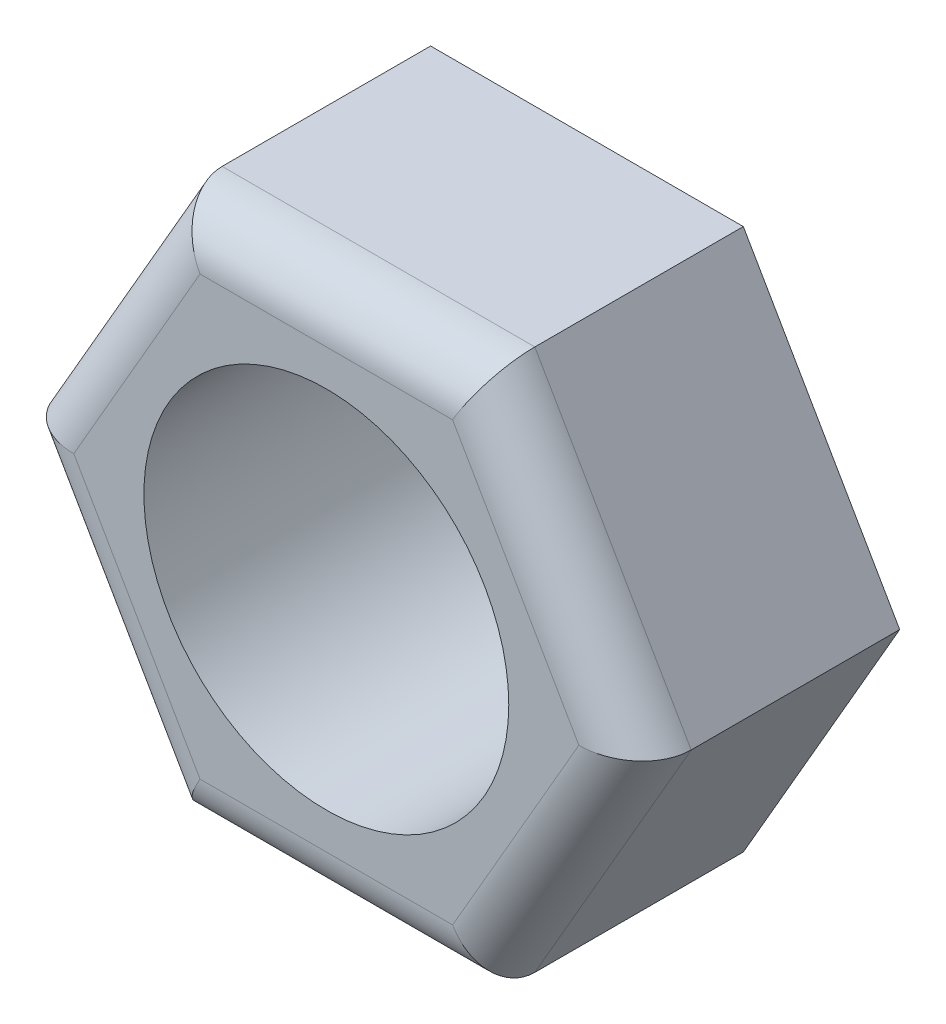
ISO-10303-21;
HEADER;
FILE_DESCRIPTION(('STEP AP214'),'2;1');
FILE_NAME('part.step','',(''),(''),'','','');
FILE_SCHEMA(('AUTOMOTIVE_DESIGN { 1 0 10303 214 1 1 1 1 }'));
ENDSEC;
DATA;
#1=APPLICATION_CONTEXT('core data for automotive mechanical design processes');
#2=APPLICATION_PROTOCOL_DEFINITION('international standard','automotive_design',2000,#1);
#3=PRODUCT_CONTEXT('',#1,'mechanical');
#4=PRODUCT('Part','Part','',(#3));
#5=PRODUCT_RELATED_PRODUCT_CATEGORY('part','',(#4));
#6=PRODUCT_DEFINITION_FORMATION('','',#4);
#7=PRODUCT_DEFINITION_CONTEXT('part definition',#1,'design');
#8=PRODUCT_DEFINITION('design','',#6,#7);
#9=PRODUCT_DEFINITION_SHAPE('','',#8);
#10=(LENGTH_UNIT() NAMED_UNIT(*) SI_UNIT(.MILLI.,.METRE.));
#11=(NAMED_UNIT(*) PLANE_ANGLE_UNIT() SI_UNIT($,.RADIAN.));
#12=(NAMED_UNIT(*) SI_UNIT($,.STERADIAN.) SOLID_ANGLE_UNIT());
#13=UNCERTAINTY_MEASURE_WITH_UNIT(LENGTH_MEASURE(1.E-05),#10,'distance_accuracy_value','');
#14=(GEOMETRIC_REPRESENTATION_CONTEXT(3) GLOBAL_UNCERTAINTY_ASSIGNED_CONTEXT((#13)) GLOBAL_UNIT_ASSIGNED_CONTEXT((#10,
#11,#12)) REPRESENTATION_CONTEXT('',''));
#15=CARTESIAN_POINT('',(0.,0.,0.));
#16=DIRECTION('',(0.,0.,1.));
#17=DIRECTION('',(1.,0.,0.));
#18=AXIS2_PLACEMENT_3D('',#15,#16,#17);
#19=CARTESIAN_POINT('',(0.,0.,2.5));
#20=DIRECTION('',(0.,0.,1.));
#21=DIRECTION('',(1.,0.,0.));
#22=AXIS2_PLACEMENT_3D('',#19,#20,#21);
#23=PLANE('',#22);
#24=DIRECTION('',(-1.,0.,0.));
#25=VECTOR('',#24,1.);
#26=CARTESIAN_POINT('',(-1.5,2.09807621135332,2.5));
#27=LINE('',#26,#25);
#28=CARTESIAN_POINT('',(1.21132486540518,2.09807621135332,2.5));
#29=VERTEX_POINT('',#28);
#30=CARTESIAN_POINT('',(-1.21132486540519,2.09807621135332,2.5));
#31=VERTEX_POINT('',#30);
#32=EDGE_CURVE('E110',#29,#31,#27,.T.);
#33=ORIENTED_EDGE('',*,*,#32,.T.);
#34=DIRECTION('',(-0.5,-0.866025403784439,0.));
#35=VECTOR('',#34,1.);
#36=CARTESIAN_POINT('',(-2.56698729810778,-0.250000000000002,2.5));
#37=LINE('',#36,#35);
#38=CARTESIAN_POINT('',(-2.42264973081038,0.,2.5));
#39=VERTEX_POINT('',#38);
#40=EDGE_CURVE('E160',#31,#39,#37,.T.);
#41=ORIENTED_EDGE('',*,*,#40,.T.);
#42=DIRECTION('',(0.5,-0.866025403784439,0.));
#43=VECTOR('',#42,1.);
#44=CARTESIAN_POINT('',(-1.06698729810778,-2.34807621135332,2.5));
#45=LINE('',#44,#43);
#46=CARTESIAN_POINT('',(-1.21132486540519,-2.09807621135332,2.5));
#47=VERTEX_POINT('',#46);
#48=EDGE_CURVE('E158',#39,#47,#45,.T.);
#49=ORIENTED_EDGE('',*,*,#48,.T.);
#50=DIRECTION('',(1.,0.,0.));
#51=VECTOR('',#50,1.);
#52=CARTESIAN_POINT('',(1.5,-2.09807621135332,2.5));
#53=LINE('',#52,#51);
#54=CARTESIAN_POINT('',(1.21132486540518,-2.09807621135332,2.5));
#55=VERTEX_POINT('',#54);
#56=EDGE_CURVE('E156',#47,#55,#53,.T.);
#57=ORIENTED_EDGE('',*,*,#56,.T.);
#58=DIRECTION('',(0.500000000000001,0.866025403784438,0.));
#59=VECTOR('',#58,1.);
#60=CARTESIAN_POINT('',(2.56698729810778,0.250000000000001,2.5));
#61=LINE('',#60,#59);
#62=CARTESIAN_POINT('',(2.42264973081037,0.,2.5));
#63=VERTEX_POINT('',#62);
#64=EDGE_CURVE('E154',#55,#63,#61,.T.);
#65=ORIENTED_EDGE('',*,*,#64,.T.);
#66=DIRECTION('',(-0.5,0.866025403784438,0.));
#67=VECTOR('',#66,1.);
#68=CARTESIAN_POINT('',(1.06698729810778,2.34807621135332,2.5));
#69=LINE('',#68,#67);
#70=EDGE_CURVE('E152',#63,#29,#69,.T.);
#71=ORIENTED_EDGE('',*,*,#70,.T.);
#72=EDGE_LOOP('',(#33,#41,#49,#57,#65,#71));
#73=FACE_BOUND('',#72,.T.);
#74=CARTESIAN_POINT('',(0.,0.,2.5));
#75=DIRECTION('',(0.,0.,1.));
#76=DIRECTION('',(1.,0.,0.));
#77=AXIS2_PLACEMENT_3D('',#74,#75,#76);
#78=CIRCLE('',#77,1.75);
#79=CARTESIAN_POINT('',(1.75,0.,2.5));
#80=VERTEX_POINT('',#79);
#81=EDGE_CURVE('E127',#80,#80,#78,.T.);
#82=ORIENTED_EDGE('',*,*,#81,.F.);
#83=EDGE_LOOP('',(#82));
#84=FACE_BOUND('',#83,.T.);
#85=ADVANCED_FACE('F33',(#73,#84),#23,.T.);
#86=CARTESIAN_POINT('',(0.,0.,0.));
#87=DIRECTION('',(0.,0.,1.));
#88=DIRECTION('',(1.,0.,0.));
#89=AXIS2_PLACEMENT_3D('',#86,#87,#88);
#90=PLANE('',#89);
#91=DIRECTION('',(0.5,0.866025403784438,0.));
#92=VECTOR('',#91,1.);
#93=CARTESIAN_POINT('',(1.5,-2.59807621135332,0.));
#94=LINE('',#93,#92);
#95=CARTESIAN_POINT('',(1.5,-2.59807621135332,0.));
#96=VERTEX_POINT('',#95);
#97=CARTESIAN_POINT('',(3.,0.,0.));
#98=VERTEX_POINT('',#97);
#99=EDGE_CURVE('E118',#96,#98,#94,.T.);
#100=ORIENTED_EDGE('',*,*,#99,.F.);
#101=DIRECTION('',(1.,0.,0.));
#102=VECTOR('',#101,1.);
#103=CARTESIAN_POINT('',(-1.5,-2.59807621135332,0.));
#104=LINE('',#103,#102);
#105=CARTESIAN_POINT('',(-1.5,-2.59807621135332,0.));
#106=VERTEX_POINT('',#105);
#107=EDGE_CURVE('E141',#106,#96,#104,.T.);
#108=ORIENTED_EDGE('',*,*,#107,.F.);
#109=DIRECTION('',(0.5,-0.866025403784439,0.));
#110=VECTOR('',#109,1.);
#111=CARTESIAN_POINT('',(-3.,0.,0.));
#112=LINE('',#111,#110);
#113=CARTESIAN_POINT('',(-3.,0.,0.));
#114=VERTEX_POINT('',#113);
#115=EDGE_CURVE('E138',#114,#106,#112,.T.);
#116=ORIENTED_EDGE('',*,*,#115,.F.);
#117=DIRECTION('',(-0.5,-0.866025403784438,0.));
#118=VECTOR('',#117,1.);
#119=CARTESIAN_POINT('',(-1.5,2.59807621135332,0.));
#120=LINE('',#119,#118);
#121=CARTESIAN_POINT('',(-1.5,2.59807621135332,0.));
#122=VERTEX_POINT('',#121);
#123=EDGE_CURVE('E135',#122,#114,#120,.T.);
#124=ORIENTED_EDGE('',*,*,#123,.F.);
#125=DIRECTION('',(-1.,0.,0.));
#126=VECTOR('',#125,1.);
#127=CARTESIAN_POINT('',(1.49999999999999,2.59807621135332,0.));
#128=LINE('',#127,#126);
#129=CARTESIAN_POINT('',(1.49999999999999,2.59807621135332,0.));
#130=VERTEX_POINT('',#129);
#131=EDGE_CURVE('E121',#130,#122,#128,.T.);
#132=ORIENTED_EDGE('',*,*,#131,.F.);
#133=DIRECTION('',(-0.5,0.866025403784438,0.));
#134=VECTOR('',#133,1.);
#135=CARTESIAN_POINT('',(3.,0.,0.));
#136=LINE('',#135,#134);
#137=EDGE_CURVE('E105',#98,#130,#136,.T.);
#138=ORIENTED_EDGE('',*,*,#137,.F.);
#139=EDGE_LOOP('',(#100,#108,#116,#124,#132,#138));
#140=FACE_BOUND('',#139,.T.);
#141=CARTESIAN_POINT('',(0.,0.,0.));
#142=DIRECTION('',(0.,0.,1.));
#143=DIRECTION('',(1.,0.,0.));
#144=AXIS2_PLACEMENT_3D('',#141,#142,#143);
#145=CIRCLE('',#144,1.75);
#146=CARTESIAN_POINT('',(1.75,0.,0.));
#147=VERTEX_POINT('',#146);
#148=EDGE_CURVE('E130',#147,#147,#145,.T.);
#149=ORIENTED_EDGE('',*,*,#148,.T.);
#150=EDGE_LOOP('',(#149));
#151=FACE_BOUND('',#150,.T.);
#152=ADVANCED_FACE('F115',(#140,#151),#90,.F.);
#153=CARTESIAN_POINT('',(1.5,-2.59807621135332,2.5));
#154=DIRECTION('',(-0.866025403784438,0.5,0.));
#155=DIRECTION('',(-0.500000000000001,-0.866025403784438,0.));
#156=AXIS2_PLACEMENT_3D('',#153,#154,#155);
#157=PLANE('',#156);
#158=DIRECTION('',(0.,0.,-1.));
#159=VECTOR('',#158,1.);
#160=CARTESIAN_POINT('',(3.,0.,2.5));
#161=LINE('',#160,#159);
#162=CARTESIAN_POINT('',(3.,0.,2.));
#163=VERTEX_POINT('',#162);
#164=EDGE_CURVE('E102',#163,#98,#161,.T.);
#165=ORIENTED_EDGE('',*,*,#164,.F.);
#166=DIRECTION('',(0.500000000000001,0.866025403784438,0.));
#167=VECTOR('',#166,1.);
#168=CARTESIAN_POINT('',(1.5,-2.59807621135332,2.));
#169=LINE('',#168,#167);
#170=CARTESIAN_POINT('',(1.5,-2.59807621135332,2.));
#171=VERTEX_POINT('',#170);
#172=EDGE_CURVE('E170',#163,#171,#169,.F.);
#173=ORIENTED_EDGE('',*,*,#172,.T.);
#174=DIRECTION('',(0.,0.,-1.));
#175=VECTOR('',#174,1.);
#176=CARTESIAN_POINT('',(1.5,-2.59807621135332,2.5));
#177=LINE('',#176,#175);
#178=EDGE_CURVE('E125',#171,#96,#177,.T.);
#179=ORIENTED_EDGE('',*,*,#178,.T.);
#180=ORIENTED_EDGE('',*,*,#99,.T.);
#181=EDGE_LOOP('',(#165,#173,#179,#180));
#182=FACE_BOUND('',#181,.T.);
#183=ADVANCED_FACE('F123',(#182),#157,.F.);
#184=CARTESIAN_POINT('',(3.,0.,2.5));
#185=DIRECTION('',(-0.866025403784438,-0.5,0.));
#186=DIRECTION('',(0.5,-0.866025403784438,0.));
#187=AXIS2_PLACEMENT_3D('',#184,#185,#186);
#188=PLANE('',#187);
#189=DIRECTION('',(0.,0.,-1.));
#190=VECTOR('',#189,1.);
#191=CARTESIAN_POINT('',(1.49999999999999,2.59807621135332,2.5));
#192=LINE('',#191,#190);
#193=CARTESIAN_POINT('',(1.49999999999999,2.59807621135332,2.));
#194=VERTEX_POINT('',#193);
#195=EDGE_CURVE('E111',#194,#130,#192,.T.);
#196=ORIENTED_EDGE('',*,*,#195,.F.);
#197=DIRECTION('',(-0.5,0.866025403784438,0.));
#198=VECTOR('',#197,1.);
#199=CARTESIAN_POINT('',(3.,0.,2.));
#200=LINE('',#199,#198);
#201=EDGE_CURVE('E42',#194,#163,#200,.F.);
#202=ORIENTED_EDGE('',*,*,#201,.T.);
#203=ORIENTED_EDGE('',*,*,#164,.T.);
#204=ORIENTED_EDGE('',*,*,#137,.T.);
#205=EDGE_LOOP('',(#196,#202,#203,#204));
#206=FACE_BOUND('',#205,.T.);
#207=ADVANCED_FACE('F104',(#206),#188,.F.);
#208=CARTESIAN_POINT('',(1.49999999999999,2.59807621135332,2.5));
#209=DIRECTION('',(0.,-1.,0.));
#210=DIRECTION('',(0.,0.,-1.));
#211=AXIS2_PLACEMENT_3D('',#208,#209,#210);
#212=PLANE('',#211);
#213=DIRECTION('',(0.,0.,-1.));
#214=VECTOR('',#213,1.);
#215=CARTESIAN_POINT('',(-1.5,2.59807621135332,2.5));
#216=LINE('',#215,#214);
#217=CARTESIAN_POINT('',(-1.5,2.59807621135332,2.));
#218=VERTEX_POINT('',#217);
#219=EDGE_CURVE('E148',#218,#122,#216,.T.);
#220=ORIENTED_EDGE('',*,*,#219,.F.);
#221=DIRECTION('',(-1.,0.,0.));
#222=VECTOR('',#221,1.);
#223=CARTESIAN_POINT('',(1.49999999999999,2.59807621135332,2.));
#224=LINE('',#223,#222);
#225=EDGE_CURVE('E11',#218,#194,#224,.F.);
#226=ORIENTED_EDGE('',*,*,#225,.T.);
#227=ORIENTED_EDGE('',*,*,#195,.T.);
#228=ORIENTED_EDGE('',*,*,#131,.T.);
#229=EDGE_LOOP('',(#220,#226,#227,#228));
#230=FACE_BOUND('',#229,.T.);
#231=ADVANCED_FACE('F224',(#230),#212,.F.);
#232=CARTESIAN_POINT('',(-1.5,2.59807621135332,2.5));
#233=DIRECTION('',(0.866025403784439,-0.5,0.));
#234=DIRECTION('',(0.5,0.866025403784439,0.));
#235=AXIS2_PLACEMENT_3D('',#232,#233,#234);
#236=PLANE('',#235);
#237=DIRECTION('',(0.,0.,-1.));
#238=VECTOR('',#237,1.);
#239=CARTESIAN_POINT('',(-3.,0.,2.5));
#240=LINE('',#239,#238);
#241=CARTESIAN_POINT('',(-3.,0.,2.));
#242=VERTEX_POINT('',#241);
#243=EDGE_CURVE('E146',#242,#114,#240,.T.);
#244=ORIENTED_EDGE('',*,*,#243,.F.);
#245=DIRECTION('',(-0.5,-0.866025403784439,0.));
#246=VECTOR('',#245,1.);
#247=CARTESIAN_POINT('',(-1.5,2.59807621135332,2.));
#248=LINE('',#247,#246);
#249=EDGE_CURVE('E163',#242,#218,#248,.F.);
#250=ORIENTED_EDGE('',*,*,#249,.T.);
#251=ORIENTED_EDGE('',*,*,#219,.T.);
#252=ORIENTED_EDGE('',*,*,#123,.T.);
#253=EDGE_LOOP('',(#244,#250,#251,#252));
#254=FACE_BOUND('',#253,.T.);
#255=ADVANCED_FACE('F220',(#254),#236,.F.);
#256=CARTESIAN_POINT('',(-3.,0.,2.5));
#257=DIRECTION('',(0.866025403784439,0.5,0.));
#258=DIRECTION('',(-0.5,0.866025403784439,0.));
#259=AXIS2_PLACEMENT_3D('',#256,#257,#258);
#260=PLANE('',#259);
#261=DIRECTION('',(0.,0.,-1.));
#262=VECTOR('',#261,1.);
#263=CARTESIAN_POINT('',(-1.5,-2.59807621135332,2.5));
#264=LINE('',#263,#262);
#265=CARTESIAN_POINT('',(-1.5,-2.59807621135332,2.));
#266=VERTEX_POINT('',#265);
#267=EDGE_CURVE('E144',#266,#106,#264,.T.);
#268=ORIENTED_EDGE('',*,*,#267,.F.);
#269=DIRECTION('',(0.5,-0.866025403784439,0.));
#270=VECTOR('',#269,1.);
#271=CARTESIAN_POINT('',(-3.,0.,2.));
#272=LINE('',#271,#270);
#273=EDGE_CURVE('E166',#266,#242,#272,.F.);
#274=ORIENTED_EDGE('',*,*,#273,.T.);
#275=ORIENTED_EDGE('',*,*,#243,.T.);
#276=ORIENTED_EDGE('',*,*,#115,.T.);
#277=EDGE_LOOP('',(#268,#274,#275,#276));
#278=FACE_BOUND('',#277,.T.);
#279=ADVANCED_FACE('F206',(#278),#260,.F.);
#280=CARTESIAN_POINT('',(-1.5,-2.59807621135332,2.5));
#281=DIRECTION('',(0.,1.,0.));
#282=DIRECTION('',(0.,0.,1.));
#283=AXIS2_PLACEMENT_3D('',#280,#281,#282);
#284=PLANE('',#283);
#285=ORIENTED_EDGE('',*,*,#178,.F.);
#286=DIRECTION('',(1.,0.,0.));
#287=VECTOR('',#286,1.);
#288=CARTESIAN_POINT('',(-1.5,-2.59807621135332,2.));
#289=LINE('',#288,#287);
#290=EDGE_CURVE('E168',#171,#266,#289,.F.);
#291=ORIENTED_EDGE('',*,*,#290,.T.);
#292=ORIENTED_EDGE('',*,*,#267,.T.);
#293=ORIENTED_EDGE('',*,*,#107,.T.);
#294=EDGE_LOOP('',(#285,#291,#292,#293));
#295=FACE_BOUND('',#294,.T.);
#296=ADVANCED_FACE('F197',(#295),#284,.F.);
#297=CARTESIAN_POINT('',(0.,0.,2.5));
#298=DIRECTION('',(0.,0.,-1.));
#299=DIRECTION('',(-1.,0.,0.));
#300=AXIS2_PLACEMENT_3D('',#297,#298,#299);
#301=CYLINDRICAL_SURFACE('',#300,1.75);
#302=ORIENTED_EDGE('',*,*,#81,.T.);
#303=EDGE_LOOP('',(#302));
#304=FACE_BOUND('',#303,.T.);
#305=ORIENTED_EDGE('',*,*,#148,.F.);
#306=EDGE_LOOP('',(#305));
#307=FACE_BOUND('',#306,.T.);
#308=ADVANCED_FACE('F195',(#304,#307),#301,.F.);
#309=CARTESIAN_POINT('',(1.81698729810778,-1.04903810567666,2.));
#310=DIRECTION('',(-0.500000000000001,-0.866025403784438,0.));
#311=DIRECTION('',(0.866025403784438,-0.500000000000001,0.));
#312=AXIS2_PLACEMENT_3D('',#309,#310,#311);
#313=CYLINDRICAL_SURFACE('',#312,0.5);
#314=CARTESIAN_POINT('',(1.21132486540518,-2.09807621135332,2.));
#315=DIRECTION('',(-0.866025403784439,-0.5,0.));
#316=DIRECTION('',(0.5,-0.866025403784439,0.));
#317=AXIS2_PLACEMENT_3D('',#314,#315,#316);
#318=ELLIPSE('',#317,0.577350269189626,0.5);
#319=EDGE_CURVE('E182',#171,#55,#318,.T.);
#320=ORIENTED_EDGE('',*,*,#319,.F.);
#321=ORIENTED_EDGE('',*,*,#172,.F.);
#322=CARTESIAN_POINT('',(2.42264973081037,0.,2.));
#323=DIRECTION('',(0.,-1.,0.));
#324=DIRECTION('',(1.,0.,0.));
#325=AXIS2_PLACEMENT_3D('',#322,#323,#324);
#326=ELLIPSE('',#325,0.577350269189626,0.5);
#327=EDGE_CURVE('E37',#63,#163,#326,.F.);
#328=ORIENTED_EDGE('',*,*,#327,.F.);
#329=ORIENTED_EDGE('',*,*,#64,.F.);
#330=EDGE_LOOP('',(#320,#321,#328,#329));
#331=FACE_BOUND('',#330,.T.);
#332=ADVANCED_FACE('F35',(#331),#313,.T.);
#333=CARTESIAN_POINT('',(1.81698729810778,1.04903810567666,2.));
#334=DIRECTION('',(0.5,-0.866025403784438,0.));
#335=DIRECTION('',(0.866025403784438,0.5,0.));
#336=AXIS2_PLACEMENT_3D('',#333,#334,#335);
#337=CYLINDRICAL_SURFACE('',#336,0.5);
#338=ORIENTED_EDGE('',*,*,#327,.T.);
#339=ORIENTED_EDGE('',*,*,#201,.F.);
#340=CARTESIAN_POINT('',(1.21132486540518,2.09807621135332,2.));
#341=DIRECTION('',(0.866025403784439,-0.5,0.));
#342=DIRECTION('',(0.5,0.866025403784439,0.));
#343=AXIS2_PLACEMENT_3D('',#340,#341,#342);
#344=ELLIPSE('',#343,0.577350269189626,0.5);
#345=EDGE_CURVE('E180',#29,#194,#344,.F.);
#346=ORIENTED_EDGE('',*,*,#345,.F.);
#347=ORIENTED_EDGE('',*,*,#70,.F.);
#348=EDGE_LOOP('',(#338,#339,#346,#347));
#349=FACE_BOUND('',#348,.T.);
#350=ADVANCED_FACE('F204',(#349),#337,.T.);
#351=CARTESIAN_POINT('',(0.,-2.09807621135332,2.));
#352=DIRECTION('',(-1.,0.,0.));
#353=DIRECTION('',(0.,0.,1.));
#354=AXIS2_PLACEMENT_3D('',#351,#352,#353);
#355=CYLINDRICAL_SURFACE('',#354,0.5);
#356=ORIENTED_EDGE('',*,*,#319,.T.);
#357=ORIENTED_EDGE('',*,*,#56,.F.);
#358=CARTESIAN_POINT('',(-1.21132486540519,-2.09807621135332,2.));
#359=DIRECTION('',(-0.866025403784439,0.5,0.));
#360=DIRECTION('',(-0.5,-0.866025403784439,0.));
#361=AXIS2_PLACEMENT_3D('',#358,#359,#360);
#362=ELLIPSE('',#361,0.577350269189626,0.5);
#363=EDGE_CURVE('E177',#266,#47,#362,.T.);
#364=ORIENTED_EDGE('',*,*,#363,.F.);
#365=ORIENTED_EDGE('',*,*,#290,.F.);
#366=EDGE_LOOP('',(#356,#357,#364,#365));
#367=FACE_BOUND('',#366,.T.);
#368=ADVANCED_FACE('F243',(#367),#355,.T.);
#369=CARTESIAN_POINT('',(0.,2.09807621135332,2.));
#370=DIRECTION('',(1.,0.,0.));
#371=DIRECTION('',(0.,0.,-1.));
#372=AXIS2_PLACEMENT_3D('',#369,#370,#371);
#373=CYLINDRICAL_SURFACE('',#372,0.5);
#374=ORIENTED_EDGE('',*,*,#345,.T.);
#375=ORIENTED_EDGE('',*,*,#225,.F.);
#376=CARTESIAN_POINT('',(-1.21132486540519,2.09807621135332,2.));
#377=DIRECTION('',(0.866025403784439,0.5,0.));
#378=DIRECTION('',(0.5,-0.866025403784439,0.));
#379=AXIS2_PLACEMENT_3D('',#376,#377,#378);
#380=ELLIPSE('',#379,0.577350269189626,0.5);
#381=EDGE_CURVE('E175',#31,#218,#380,.F.);
#382=ORIENTED_EDGE('',*,*,#381,.F.);
#383=ORIENTED_EDGE('',*,*,#32,.F.);
#384=EDGE_LOOP('',(#374,#375,#382,#383));
#385=FACE_BOUND('',#384,.T.);
#386=ADVANCED_FACE('F239',(#385),#373,.T.);
#387=CARTESIAN_POINT('',(-1.81698729810778,-1.04903810567666,2.));
#388=DIRECTION('',(-0.5,0.866025403784439,0.));
#389=DIRECTION('',(-0.866025403784439,-0.5,0.));
#390=AXIS2_PLACEMENT_3D('',#387,#388,#389);
#391=CYLINDRICAL_SURFACE('',#390,0.5);
#392=ORIENTED_EDGE('',*,*,#363,.T.);
#393=ORIENTED_EDGE('',*,*,#48,.F.);
#394=CARTESIAN_POINT('',(-2.42264973081038,0.,2.));
#395=DIRECTION('',(0.,1.,0.));
#396=DIRECTION('',(-1.,0.,0.));
#397=AXIS2_PLACEMENT_3D('',#394,#395,#396);
#398=ELLIPSE('',#397,0.577350269189626,0.5);
#399=EDGE_CURVE('E173',#242,#39,#398,.T.);
#400=ORIENTED_EDGE('',*,*,#399,.F.);
#401=ORIENTED_EDGE('',*,*,#273,.F.);
#402=EDGE_LOOP('',(#392,#393,#400,#401));
#403=FACE_BOUND('',#402,.T.);
#404=ADVANCED_FACE('F235',(#403),#391,.T.);
#405=CARTESIAN_POINT('',(-1.81698729810778,1.04903810567666,2.));
#406=DIRECTION('',(0.5,0.866025403784439,0.));
#407=DIRECTION('',(-0.866025403784439,0.5,0.));
#408=AXIS2_PLACEMENT_3D('',#405,#406,#407);
#409=CYLINDRICAL_SURFACE('',#408,0.5);
#410=ORIENTED_EDGE('',*,*,#381,.T.);
#411=ORIENTED_EDGE('',*,*,#249,.F.);
#412=ORIENTED_EDGE('',*,*,#399,.T.);
#413=ORIENTED_EDGE('',*,*,#40,.F.);
#414=EDGE_LOOP('',(#410,#411,#412,#413));
#415=FACE_BOUND('',#414,.T.);
#416=ADVANCED_FACE('F232',(#415),#409,.T.);
#417=CLOSED_SHELL('',(#85,#152,#183,#207,#231,#255,#279,#296,#308,#332,#350,#368,#386,#404,#416));
#418=MANIFOLD_SOLID_BREP('B2',#417);
#419=ADVANCED_BREP_SHAPE_REPRESENTATION('',(#18,#418),#14);
#420=SHAPE_DEFINITION_REPRESENTATION(#9,#419);
ENDSEC;
END-ISO-10303-21;
